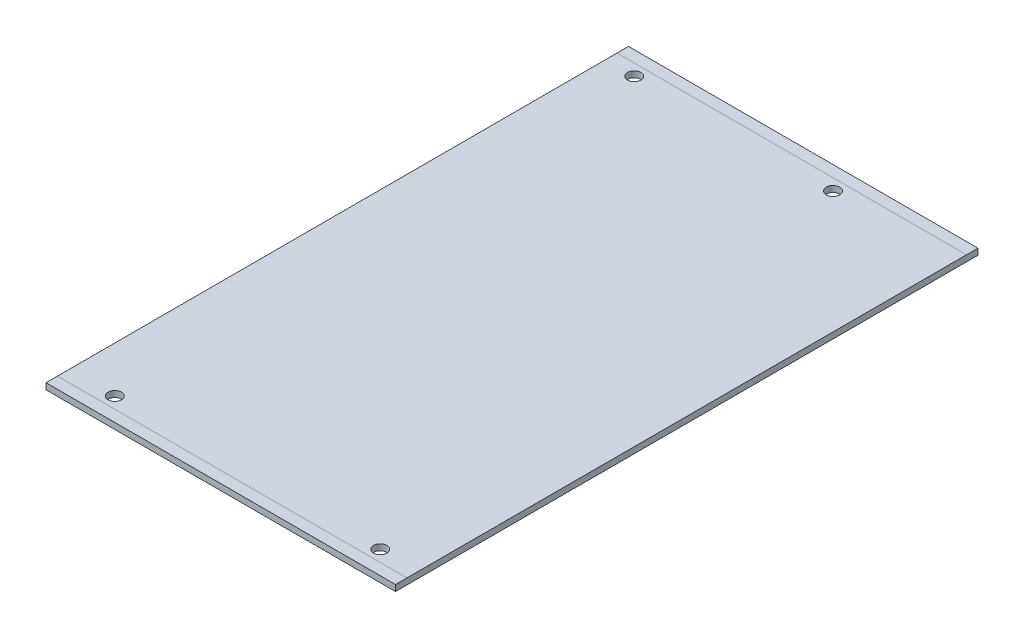
ISO-10303-21;
HEADER;
FILE_DESCRIPTION(('STEP AP214'),'2;1');
FILE_NAME('part.step','',(''),(''),'','','');
FILE_SCHEMA(('AUTOMOTIVE_DESIGN { 1 0 10303 214 1 1 1 1 }'));
ENDSEC;
DATA;
#1=APPLICATION_CONTEXT('core data for automotive mechanical design processes');
#2=APPLICATION_PROTOCOL_DEFINITION('international standard','automotive_design',2000,#1);
#3=PRODUCT_CONTEXT('',#1,'mechanical');
#4=PRODUCT('Part','Part','',(#3));
#5=PRODUCT_RELATED_PRODUCT_CATEGORY('part','',(#4));
#6=PRODUCT_DEFINITION_FORMATION('','',#4);
#7=PRODUCT_DEFINITION_CONTEXT('part definition',#1,'design');
#8=PRODUCT_DEFINITION('design','',#6,#7);
#9=PRODUCT_DEFINITION_SHAPE('','',#8);
#10=(LENGTH_UNIT() NAMED_UNIT(*) SI_UNIT(.MILLI.,.METRE.));
#11=(NAMED_UNIT(*) PLANE_ANGLE_UNIT() SI_UNIT($,.RADIAN.));
#12=(NAMED_UNIT(*) SI_UNIT($,.STERADIAN.) SOLID_ANGLE_UNIT());
#13=UNCERTAINTY_MEASURE_WITH_UNIT(LENGTH_MEASURE(1.E-05),#10,'distance_accuracy_value','');
#14=(GEOMETRIC_REPRESENTATION_CONTEXT(3) GLOBAL_UNCERTAINTY_ASSIGNED_CONTEXT((#13)) GLOBAL_UNIT_ASSIGNED_CONTEXT((#10,
#11,#12)) REPRESENTATION_CONTEXT('',''));
#15=CARTESIAN_POINT('',(0.,0.,0.));
#16=DIRECTION('',(0.,0.,1.));
#17=DIRECTION('',(1.,0.,0.));
#18=AXIS2_PLACEMENT_3D('',#15,#16,#17);
#19=CARTESIAN_POINT('',(-45.72,1.6,-76.2));
#20=DIRECTION('',(0.,0.,1.));
#21=DIRECTION('',(1.,0.,0.));
#22=AXIS2_PLACEMENT_3D('',#19,#20,#21);
#23=PLANE('',#22);
#24=DIRECTION('',(-1.,0.,0.));
#25=VECTOR('',#24,1.);
#26=CARTESIAN_POINT('',(-45.72,1.5999,-76.2));
#27=LINE('',#26,#25);
#28=CARTESIAN_POINT('',(45.72,1.5999,-76.2));
#29=VERTEX_POINT('',#28);
#30=CARTESIAN_POINT('',(-45.72,1.5999,-76.2));
#31=VERTEX_POINT('',#30);
#32=EDGE_CURVE('E163',#29,#31,#27,.T.);
#33=ORIENTED_EDGE('',*,*,#32,.F.);
#34=DIRECTION('',(0.,-1.,0.));
#35=VECTOR('',#34,1.);
#36=CARTESIAN_POINT('',(45.72,1.6,-76.2));
#37=LINE('',#36,#35);
#38=CARTESIAN_POINT('',(45.72,0.,-76.2));
#39=VERTEX_POINT('',#38);
#40=EDGE_CURVE('E11',#29,#39,#37,.T.);
#41=ORIENTED_EDGE('',*,*,#40,.T.);
#42=DIRECTION('',(-1.,0.,0.));
#43=VECTOR('',#42,1.);
#44=CARTESIAN_POINT('',(-45.72,0.,-76.2));
#45=LINE('',#44,#43);
#46=CARTESIAN_POINT('',(-45.72,0.,-76.2));
#47=VERTEX_POINT('',#46);
#48=EDGE_CURVE('E128',#39,#47,#45,.T.);
#49=ORIENTED_EDGE('',*,*,#48,.T.);
#50=DIRECTION('',(0.,-1.,0.));
#51=VECTOR('',#50,1.);
#52=CARTESIAN_POINT('',(-45.72,1.6,-76.2));
#53=LINE('',#52,#51);
#54=EDGE_CURVE('E38',#31,#47,#53,.T.);
#55=ORIENTED_EDGE('',*,*,#54,.F.);
#56=EDGE_LOOP('',(#33,#41,#49,#55));
#57=FACE_BOUND('',#56,.T.);
#58=ADVANCED_FACE('F30',(#57),#23,.F.);
#59=CARTESIAN_POINT('',(45.72,1.6,76.2));
#60=DIRECTION('',(-1.,0.,0.));
#61=DIRECTION('',(0.,0.,1.));
#62=AXIS2_PLACEMENT_3D('',#59,#60,#61);
#63=PLANE('',#62);
#64=DIRECTION('',(0.,0.,-1.));
#65=VECTOR('',#64,1.);
#66=CARTESIAN_POINT('',(45.72,1.6,76.2));
#67=LINE('',#66,#65);
#68=CARTESIAN_POINT('',(45.72,1.6,73.2));
#69=VERTEX_POINT('',#68);
#70=CARTESIAN_POINT('',(45.72,1.6,-73.2));
#71=VERTEX_POINT('',#70);
#72=EDGE_CURVE('E126',#69,#71,#67,.T.);
#73=ORIENTED_EDGE('',*,*,#72,.F.);
#74=DIRECTION('',(0.,1.,0.));
#75=VECTOR('',#74,1.);
#76=CARTESIAN_POINT('',(45.72,1.5999,73.2));
#77=LINE('',#76,#75);
#78=CARTESIAN_POINT('',(45.72,1.5999,73.2));
#79=VERTEX_POINT('',#78);
#80=EDGE_CURVE('E45',#79,#69,#77,.T.);
#81=ORIENTED_EDGE('',*,*,#80,.F.);
#82=DIRECTION('',(0.,0.,-1.));
#83=VECTOR('',#82,1.);
#84=CARTESIAN_POINT('',(45.72,1.5999,76.2));
#85=LINE('',#84,#83);
#86=CARTESIAN_POINT('',(45.72,1.5999,76.2));
#87=VERTEX_POINT('',#86);
#88=EDGE_CURVE('E114',#87,#79,#85,.T.);
#89=ORIENTED_EDGE('',*,*,#88,.F.);
#90=DIRECTION('',(0.,-1.,0.));
#91=VECTOR('',#90,1.);
#92=CARTESIAN_POINT('',(45.72,1.6,76.2));
#93=LINE('',#92,#91);
#94=CARTESIAN_POINT('',(45.72,0.,76.2));
#95=VERTEX_POINT('',#94);
#96=EDGE_CURVE('E113',#87,#95,#93,.T.);
#97=ORIENTED_EDGE('',*,*,#96,.T.);
#98=DIRECTION('',(0.,0.,-1.));
#99=VECTOR('',#98,1.);
#100=CARTESIAN_POINT('',(45.72,0.,76.2));
#101=LINE('',#100,#99);
#102=EDGE_CURVE('E131',#95,#39,#101,.T.);
#103=ORIENTED_EDGE('',*,*,#102,.T.);
#104=ORIENTED_EDGE('',*,*,#40,.F.);
#105=DIRECTION('',(0.,0.,-1.));
#106=VECTOR('',#105,1.);
#107=CARTESIAN_POINT('',(45.72,1.5999,-76.2));
#108=LINE('',#107,#106);
#109=CARTESIAN_POINT('',(45.72,1.5999,-73.2));
#110=VERTEX_POINT('',#109);
#111=EDGE_CURVE('E171',#110,#29,#108,.T.);
#112=ORIENTED_EDGE('',*,*,#111,.F.);
#113=DIRECTION('',(0.,1.,0.));
#114=VECTOR('',#113,1.);
#115=CARTESIAN_POINT('',(45.72,1.5999,-73.2));
#116=LINE('',#115,#114);
#117=EDGE_CURVE('E159',#110,#71,#116,.T.);
#118=ORIENTED_EDGE('',*,*,#117,.T.);
#119=EDGE_LOOP('',(#73,#81,#89,#97,#103,#104,#112,#118));
#120=FACE_BOUND('',#119,.T.);
#121=ADVANCED_FACE('F32',(#120),#63,.F.);
#122=CARTESIAN_POINT('',(-45.72,1.6,76.2));
#123=DIRECTION('',(1.,0.,0.));
#124=DIRECTION('',(0.,0.,-1.));
#125=AXIS2_PLACEMENT_3D('',#122,#123,#124);
#126=PLANE('',#125);
#127=DIRECTION('',(0.,0.,1.));
#128=VECTOR('',#127,1.);
#129=CARTESIAN_POINT('',(-45.72,1.5999,76.2));
#130=LINE('',#129,#128);
#131=CARTESIAN_POINT('',(-45.72,1.5999,73.2));
#132=VERTEX_POINT('',#131);
#133=CARTESIAN_POINT('',(-45.72,1.5999,76.2));
#134=VERTEX_POINT('',#133);
#135=EDGE_CURVE('E96',#132,#134,#130,.T.);
#136=ORIENTED_EDGE('',*,*,#135,.F.);
#137=DIRECTION('',(0.,1.,0.));
#138=VECTOR('',#137,1.);
#139=CARTESIAN_POINT('',(-45.72,1.5999,73.2));
#140=LINE('',#139,#138);
#141=CARTESIAN_POINT('',(-45.72,1.6,73.2));
#142=VERTEX_POINT('',#141);
#143=EDGE_CURVE('E169',#132,#142,#140,.T.);
#144=ORIENTED_EDGE('',*,*,#143,.T.);
#145=DIRECTION('',(0.,0.,1.));
#146=VECTOR('',#145,1.);
#147=CARTESIAN_POINT('',(-45.72,1.6,76.2));
#148=LINE('',#147,#146);
#149=CARTESIAN_POINT('',(-45.72,1.6,-73.2));
#150=VERTEX_POINT('',#149);
#151=EDGE_CURVE('E121',#150,#142,#148,.T.);
#152=ORIENTED_EDGE('',*,*,#151,.F.);
#153=DIRECTION('',(0.,1.,0.));
#154=VECTOR('',#153,1.);
#155=CARTESIAN_POINT('',(-45.72,1.5999,-73.2));
#156=LINE('',#155,#154);
#157=CARTESIAN_POINT('',(-45.72,1.5999,-73.2));
#158=VERTEX_POINT('',#157);
#159=EDGE_CURVE('E53',#158,#150,#156,.T.);
#160=ORIENTED_EDGE('',*,*,#159,.F.);
#161=DIRECTION('',(0.,0.,1.));
#162=VECTOR('',#161,1.);
#163=CARTESIAN_POINT('',(-45.72,1.5999,-76.2));
#164=LINE('',#163,#162);
#165=EDGE_CURVE('E168',#31,#158,#164,.T.);
#166=ORIENTED_EDGE('',*,*,#165,.F.);
#167=ORIENTED_EDGE('',*,*,#54,.T.);
#168=DIRECTION('',(0.,0.,1.));
#169=VECTOR('',#168,1.);
#170=CARTESIAN_POINT('',(-45.72,0.,76.2));
#171=LINE('',#170,#169);
#172=CARTESIAN_POINT('',(-45.72,0.,76.2));
#173=VERTEX_POINT('',#172);
#174=EDGE_CURVE('E118',#47,#173,#171,.T.);
#175=ORIENTED_EDGE('',*,*,#174,.T.);
#176=DIRECTION('',(0.,-1.,0.));
#177=VECTOR('',#176,1.);
#178=CARTESIAN_POINT('',(-45.72,1.6,76.2));
#179=LINE('',#178,#177);
#180=EDGE_CURVE('E111',#134,#173,#179,.T.);
#181=ORIENTED_EDGE('',*,*,#180,.F.);
#182=EDGE_LOOP('',(#136,#144,#152,#160,#166,#167,#175,#181));
#183=FACE_BOUND('',#182,.T.);
#184=ADVANCED_FACE('F116',(#183),#126,.F.);
#185=CARTESIAN_POINT('',(-45.72,1.6,76.2));
#186=DIRECTION('',(0.,0.,-1.));
#187=DIRECTION('',(-1.,0.,0.));
#188=AXIS2_PLACEMENT_3D('',#185,#186,#187);
#189=PLANE('',#188);
#190=ORIENTED_EDGE('',*,*,#96,.F.);
#191=DIRECTION('',(1.,0.,0.));
#192=VECTOR('',#191,1.);
#193=CARTESIAN_POINT('',(-45.72,1.5999,76.2));
#194=LINE('',#193,#192);
#195=EDGE_CURVE('E99',#134,#87,#194,.T.);
#196=ORIENTED_EDGE('',*,*,#195,.F.);
#197=ORIENTED_EDGE('',*,*,#180,.T.);
#198=DIRECTION('',(1.,0.,0.));
#199=VECTOR('',#198,1.);
#200=CARTESIAN_POINT('',(-45.72,0.,76.2));
#201=LINE('',#200,#199);
#202=EDGE_CURVE('E124',#173,#95,#201,.T.);
#203=ORIENTED_EDGE('',*,*,#202,.T.);
#204=EDGE_LOOP('',(#190,#196,#197,#203));
#205=FACE_BOUND('',#204,.T.);
#206=ADVANCED_FACE('F109',(#205),#189,.F.);
#207=CARTESIAN_POINT('',(45.72,1.6,-76.2));
#208=DIRECTION('',(0.,-1.,0.));
#209=DIRECTION('',(0.,0.,-1.));
#210=AXIS2_PLACEMENT_3D('',#207,#208,#209);
#211=PLANE('',#210);
#212=CARTESIAN_POINT('',(-38.22,1.6,-70.2));
#213=DIRECTION('',(0.,1.,0.));
#214=DIRECTION('',(0.,0.,1.));
#215=AXIS2_PLACEMENT_3D('',#212,#213,#214);
#216=CIRCLE('',#215,1.75);
#217=CARTESIAN_POINT('',(-38.22,1.6,-68.45));
#218=VERTEX_POINT('',#217);
#219=EDGE_CURVE('E153',#218,#218,#216,.T.);
#220=ORIENTED_EDGE('',*,*,#219,.F.);
#221=EDGE_LOOP('',(#220));
#222=FACE_BOUND('',#221,.T.);
#223=CARTESIAN_POINT('',(13.78,1.6,-70.2));
#224=DIRECTION('',(0.,1.,0.));
#225=DIRECTION('',(0.,0.,1.));
#226=AXIS2_PLACEMENT_3D('',#223,#224,#225);
#227=CIRCLE('',#226,1.75);
#228=CARTESIAN_POINT('',(13.78,1.6,-68.45));
#229=VERTEX_POINT('',#228);
#230=EDGE_CURVE('E147',#229,#229,#227,.T.);
#231=ORIENTED_EDGE('',*,*,#230,.F.);
#232=EDGE_LOOP('',(#231));
#233=FACE_BOUND('',#232,.T.);
#234=CARTESIAN_POINT('',(-33.72,1.6,70.2));
#235=DIRECTION('',(0.,1.,0.));
#236=DIRECTION('',(0.,0.,1.));
#237=AXIS2_PLACEMENT_3D('',#234,#235,#236);
#238=CIRCLE('',#237,1.75);
#239=CARTESIAN_POINT('',(-33.72,1.6,71.95));
#240=VERTEX_POINT('',#239);
#241=EDGE_CURVE('E141',#240,#240,#238,.T.);
#242=ORIENTED_EDGE('',*,*,#241,.F.);
#243=EDGE_LOOP('',(#242));
#244=FACE_BOUND('',#243,.T.);
#245=CARTESIAN_POINT('',(35.72,1.6,70.2));
#246=DIRECTION('',(0.,1.,0.));
#247=DIRECTION('',(0.,0.,1.));
#248=AXIS2_PLACEMENT_3D('',#245,#246,#247);
#249=CIRCLE('',#248,1.75);
#250=CARTESIAN_POINT('',(35.72,1.6,71.95));
#251=VERTEX_POINT('',#250);
#252=EDGE_CURVE('E134',#251,#251,#249,.T.);
#253=ORIENTED_EDGE('',*,*,#252,.F.);
#254=EDGE_LOOP('',(#253));
#255=FACE_BOUND('',#254,.T.);
#256=ORIENTED_EDGE('',*,*,#151,.T.);
#257=DIRECTION('',(-1.,0.,0.));
#258=VECTOR('',#257,1.);
#259=CARTESIAN_POINT('',(-45.72,1.6,73.2));
#260=LINE('',#259,#258);
#261=EDGE_CURVE('E105',#69,#142,#260,.T.);
#262=ORIENTED_EDGE('',*,*,#261,.F.);
#263=ORIENTED_EDGE('',*,*,#72,.T.);
#264=DIRECTION('',(1.,0.,0.));
#265=VECTOR('',#264,1.);
#266=CARTESIAN_POINT('',(-45.72,1.6,-73.2));
#267=LINE('',#266,#265);
#268=EDGE_CURVE('E166',#150,#71,#267,.T.);
#269=ORIENTED_EDGE('',*,*,#268,.F.);
#270=EDGE_LOOP('',(#256,#262,#263,#269));
#271=FACE_BOUND('',#270,.T.);
#272=ADVANCED_FACE('F187',(#222,#233,#244,#255,#271),#211,.F.);
#273=CARTESIAN_POINT('',(45.72,0.,-76.2));
#274=DIRECTION('',(0.,-1.,0.));
#275=DIRECTION('',(0.,0.,-1.));
#276=AXIS2_PLACEMENT_3D('',#273,#274,#275);
#277=PLANE('',#276);
#278=CARTESIAN_POINT('',(-38.22,0.,-70.2));
#279=DIRECTION('',(0.,-1.,0.));
#280=DIRECTION('',(0.,0.,-1.));
#281=AXIS2_PLACEMENT_3D('',#278,#279,#280);
#282=CIRCLE('',#281,1.75);
#283=CARTESIAN_POINT('',(-38.22,0.,-71.95));
#284=VERTEX_POINT('',#283);
#285=EDGE_CURVE('E156',#284,#284,#282,.F.);
#286=ORIENTED_EDGE('',*,*,#285,.T.);
#287=EDGE_LOOP('',(#286));
#288=FACE_BOUND('',#287,.T.);
#289=CARTESIAN_POINT('',(13.78,0.,-70.2));
#290=DIRECTION('',(0.,-1.,0.));
#291=DIRECTION('',(0.,0.,-1.));
#292=AXIS2_PLACEMENT_3D('',#289,#290,#291);
#293=CIRCLE('',#292,1.75);
#294=CARTESIAN_POINT('',(13.78,0.,-71.95));
#295=VERTEX_POINT('',#294);
#296=EDGE_CURVE('E150',#295,#295,#293,.F.);
#297=ORIENTED_EDGE('',*,*,#296,.T.);
#298=EDGE_LOOP('',(#297));
#299=FACE_BOUND('',#298,.T.);
#300=CARTESIAN_POINT('',(-33.72,0.,70.2));
#301=DIRECTION('',(0.,-1.,0.));
#302=DIRECTION('',(0.,0.,-1.));
#303=AXIS2_PLACEMENT_3D('',#300,#301,#302);
#304=CIRCLE('',#303,1.75);
#305=CARTESIAN_POINT('',(-33.72,0.,68.45));
#306=VERTEX_POINT('',#305);
#307=EDGE_CURVE('E144',#306,#306,#304,.F.);
#308=ORIENTED_EDGE('',*,*,#307,.T.);
#309=EDGE_LOOP('',(#308));
#310=FACE_BOUND('',#309,.T.);
#311=CARTESIAN_POINT('',(35.72,0.,70.2));
#312=DIRECTION('',(0.,-1.,0.));
#313=DIRECTION('',(0.,0.,-1.));
#314=AXIS2_PLACEMENT_3D('',#311,#312,#313);
#315=CIRCLE('',#314,1.75);
#316=CARTESIAN_POINT('',(35.72,0.,68.45));
#317=VERTEX_POINT('',#316);
#318=EDGE_CURVE('E138',#317,#317,#315,.F.);
#319=ORIENTED_EDGE('',*,*,#318,.T.);
#320=EDGE_LOOP('',(#319));
#321=FACE_BOUND('',#320,.T.);
#322=ORIENTED_EDGE('',*,*,#102,.F.);
#323=ORIENTED_EDGE('',*,*,#202,.F.);
#324=ORIENTED_EDGE('',*,*,#174,.F.);
#325=ORIENTED_EDGE('',*,*,#48,.F.);
#326=EDGE_LOOP('',(#322,#323,#324,#325));
#327=FACE_BOUND('',#326,.T.);
#328=ADVANCED_FACE('F200',(#288,#299,#310,#321,#327),#277,.T.);
#329=CARTESIAN_POINT('',(35.72,-0.000999999999999916,70.2));
#330=DIRECTION('',(0.,1.,0.));
#331=DIRECTION('',(0.,0.,1.));
#332=AXIS2_PLACEMENT_3D('',#329,#330,#331);
#333=CYLINDRICAL_SURFACE('',#332,1.75);
#334=ORIENTED_EDGE('',*,*,#318,.F.);
#335=EDGE_LOOP('',(#334));
#336=FACE_BOUND('',#335,.T.);
#337=ORIENTED_EDGE('',*,*,#252,.T.);
#338=EDGE_LOOP('',(#337));
#339=FACE_BOUND('',#338,.T.);
#340=ADVANCED_FACE('F202',(#336,#339),#333,.F.);
#341=CARTESIAN_POINT('',(-33.72,-0.000999999999999916,70.2));
#342=DIRECTION('',(0.,1.,0.));
#343=DIRECTION('',(0.,0.,1.));
#344=AXIS2_PLACEMENT_3D('',#341,#342,#343);
#345=CYLINDRICAL_SURFACE('',#344,1.75);
#346=ORIENTED_EDGE('',*,*,#307,.F.);
#347=EDGE_LOOP('',(#346));
#348=FACE_BOUND('',#347,.T.);
#349=ORIENTED_EDGE('',*,*,#241,.T.);
#350=EDGE_LOOP('',(#349));
#351=FACE_BOUND('',#350,.T.);
#352=ADVANCED_FACE('F209',(#348,#351),#345,.F.);
#353=CARTESIAN_POINT('',(13.78,-0.000999999999999916,-70.2));
#354=DIRECTION('',(0.,1.,0.));
#355=DIRECTION('',(0.,0.,1.));
#356=AXIS2_PLACEMENT_3D('',#353,#354,#355);
#357=CYLINDRICAL_SURFACE('',#356,1.75);
#358=ORIENTED_EDGE('',*,*,#296,.F.);
#359=EDGE_LOOP('',(#358));
#360=FACE_BOUND('',#359,.T.);
#361=ORIENTED_EDGE('',*,*,#230,.T.);
#362=EDGE_LOOP('',(#361));
#363=FACE_BOUND('',#362,.T.);
#364=ADVANCED_FACE('F272',(#360,#363),#357,.F.);
#365=CARTESIAN_POINT('',(-38.22,-0.000999999999999916,-70.2));
#366=DIRECTION('',(0.,1.,0.));
#367=DIRECTION('',(0.,0.,1.));
#368=AXIS2_PLACEMENT_3D('',#365,#366,#367);
#369=CYLINDRICAL_SURFACE('',#368,1.75);
#370=ORIENTED_EDGE('',*,*,#285,.F.);
#371=EDGE_LOOP('',(#370));
#372=FACE_BOUND('',#371,.T.);
#373=ORIENTED_EDGE('',*,*,#219,.T.);
#374=EDGE_LOOP('',(#373));
#375=FACE_BOUND('',#374,.T.);
#376=ADVANCED_FACE('F240',(#372,#375),#369,.F.);
#377=CARTESIAN_POINT('',(-45.72,1.5999,-73.2));
#378=DIRECTION('',(0.,0.,1.));
#379=DIRECTION('',(1.,0.,0.));
#380=AXIS2_PLACEMENT_3D('',#377,#378,#379);
#381=PLANE('',#380);
#382=ORIENTED_EDGE('',*,*,#268,.T.);
#383=ORIENTED_EDGE('',*,*,#117,.F.);
#384=DIRECTION('',(1.,0.,0.));
#385=VECTOR('',#384,1.);
#386=CARTESIAN_POINT('',(-45.72,1.5999,-73.2));
#387=LINE('',#386,#385);
#388=EDGE_CURVE('E173',#158,#110,#387,.T.);
#389=ORIENTED_EDGE('',*,*,#388,.F.);
#390=ORIENTED_EDGE('',*,*,#159,.T.);
#391=EDGE_LOOP('',(#382,#383,#389,#390));
#392=FACE_BOUND('',#391,.T.);
#393=ADVANCED_FACE('F189',(#392),#381,.F.);
#394=CARTESIAN_POINT('',(-45.72,1.5999,-73.2));
#395=DIRECTION('',(0.,1.,0.));
#396=DIRECTION('',(0.,0.,1.));
#397=AXIS2_PLACEMENT_3D('',#394,#395,#396);
#398=PLANE('',#397);
#399=ORIENTED_EDGE('',*,*,#165,.T.);
#400=ORIENTED_EDGE('',*,*,#388,.T.);
#401=ORIENTED_EDGE('',*,*,#111,.T.);
#402=ORIENTED_EDGE('',*,*,#32,.T.);
#403=EDGE_LOOP('',(#399,#400,#401,#402));
#404=FACE_BOUND('',#403,.T.);
#405=ADVANCED_FACE('F191',(#404),#398,.T.);
#406=CARTESIAN_POINT('',(-45.72,1.5999,73.2));
#407=DIRECTION('',(0.,0.,-1.));
#408=DIRECTION('',(-1.,0.,0.));
#409=AXIS2_PLACEMENT_3D('',#406,#407,#408);
#410=PLANE('',#409);
#411=ORIENTED_EDGE('',*,*,#261,.T.);
#412=ORIENTED_EDGE('',*,*,#143,.F.);
#413=DIRECTION('',(-1.,0.,0.));
#414=VECTOR('',#413,1.);
#415=CARTESIAN_POINT('',(-45.72,1.5999,73.2));
#416=LINE('',#415,#414);
#417=EDGE_CURVE('E101',#79,#132,#416,.T.);
#418=ORIENTED_EDGE('',*,*,#417,.F.);
#419=ORIENTED_EDGE('',*,*,#80,.T.);
#420=EDGE_LOOP('',(#411,#412,#418,#419));
#421=FACE_BOUND('',#420,.T.);
#422=ADVANCED_FACE('F183',(#421),#410,.F.);
#423=CARTESIAN_POINT('',(-45.72,1.5999,73.2));
#424=DIRECTION('',(0.,-1.,0.));
#425=DIRECTION('',(0.,0.,-1.));
#426=AXIS2_PLACEMENT_3D('',#423,#424,#425);
#427=PLANE('',#426);
#428=ORIENTED_EDGE('',*,*,#135,.T.);
#429=ORIENTED_EDGE('',*,*,#195,.T.);
#430=ORIENTED_EDGE('',*,*,#88,.T.);
#431=ORIENTED_EDGE('',*,*,#417,.T.);
#432=EDGE_LOOP('',(#428,#429,#430,#431));
#433=FACE_BOUND('',#432,.T.);
#434=ADVANCED_FACE('F98',(#433),#427,.F.);
#435=CLOSED_SHELL('',(#58,#121,#184,#206,#272,#328,#340,#352,#364,#376,#393,#405,#422,#434));
#436=MANIFOLD_SOLID_BREP('B2',#435);
#437=ADVANCED_BREP_SHAPE_REPRESENTATION('',(#18,#436),#14);
#438=SHAPE_DEFINITION_REPRESENTATION(#9,#437);
ENDSEC;
END-ISO-10303-21;
